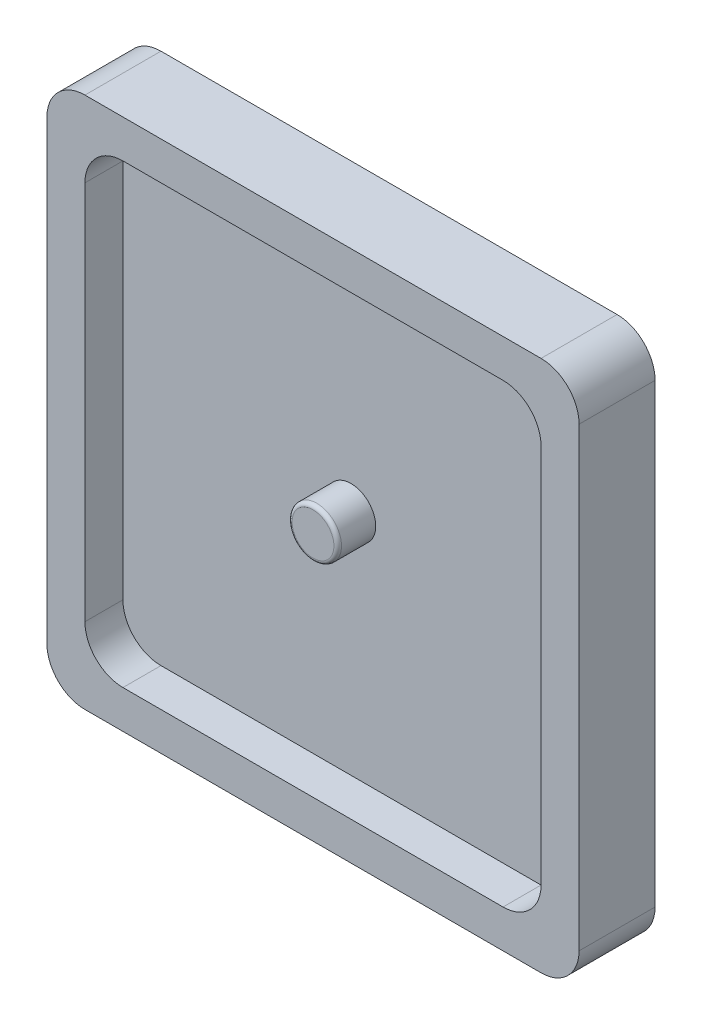
ISO-10303-21;
HEADER;
FILE_DESCRIPTION(('STEP AP214'),'2;1');
FILE_NAME('part.step','',(''),(''),'','','');
FILE_SCHEMA(('AUTOMOTIVE_DESIGN { 1 0 10303 214 1 1 1 1 }'));
ENDSEC;
DATA;
#1=APPLICATION_CONTEXT('core data for automotive mechanical design processes');
#2=APPLICATION_PROTOCOL_DEFINITION('international standard','automotive_design',2000,#1);
#3=PRODUCT_CONTEXT('',#1,'mechanical');
#4=PRODUCT('Part','Part','',(#3));
#5=PRODUCT_RELATED_PRODUCT_CATEGORY('part','',(#4));
#6=PRODUCT_DEFINITION_FORMATION('','',#4);
#7=PRODUCT_DEFINITION_CONTEXT('part definition',#1,'design');
#8=PRODUCT_DEFINITION('design','',#6,#7);
#9=PRODUCT_DEFINITION_SHAPE('','',#8);
#10=(LENGTH_UNIT() NAMED_UNIT(*) SI_UNIT(.MILLI.,.METRE.));
#11=(NAMED_UNIT(*) PLANE_ANGLE_UNIT() SI_UNIT($,.RADIAN.));
#12=(NAMED_UNIT(*) SI_UNIT($,.STERADIAN.) SOLID_ANGLE_UNIT());
#13=UNCERTAINTY_MEASURE_WITH_UNIT(LENGTH_MEASURE(1.E-05),#10,'distance_accuracy_value','');
#14=(GEOMETRIC_REPRESENTATION_CONTEXT(3) GLOBAL_UNCERTAINTY_ASSIGNED_CONTEXT((#13)) GLOBAL_UNIT_ASSIGNED_CONTEXT((#10,
#11,#12)) REPRESENTATION_CONTEXT('',''));
#15=CARTESIAN_POINT('',(0.,0.,0.));
#16=DIRECTION('',(0.,0.,1.));
#17=DIRECTION('',(1.,0.,0.));
#18=AXIS2_PLACEMENT_3D('',#15,#16,#17);
#19=CARTESIAN_POINT('',(70.,-70.,20.));
#20=DIRECTION('',(-1.,0.,0.));
#21=DIRECTION('',(0.,0.,1.));
#22=AXIS2_PLACEMENT_3D('',#19,#20,#21);
#23=PLANE('',#22);
#24=DIRECTION('',(0.,1.,0.));
#25=VECTOR('',#24,1.);
#26=CARTESIAN_POINT('',(70.,-70.,20.));
#27=LINE('',#26,#25);
#28=CARTESIAN_POINT('',(70.,-60.,20.));
#29=VERTEX_POINT('',#28);
#30=CARTESIAN_POINT('',(70.,60.,20.));
#31=VERTEX_POINT('',#30);
#32=EDGE_CURVE('E189',#29,#31,#27,.T.);
#33=ORIENTED_EDGE('',*,*,#32,.F.);
#34=DIRECTION('',(0.,0.,-1.));
#35=VECTOR('',#34,1.);
#36=CARTESIAN_POINT('',(70.,-60.,20.));
#37=LINE('',#36,#35);
#38=CARTESIAN_POINT('',(70.,-60.,0.));
#39=VERTEX_POINT('',#38);
#40=EDGE_CURVE('E238',#29,#39,#37,.T.);
#41=ORIENTED_EDGE('',*,*,#40,.T.);
#42=DIRECTION('',(0.,1.,0.));
#43=VECTOR('',#42,1.);
#44=CARTESIAN_POINT('',(70.,-70.,0.));
#45=LINE('',#44,#43);
#46=CARTESIAN_POINT('',(70.,60.,0.));
#47=VERTEX_POINT('',#46);
#48=EDGE_CURVE('E200',#39,#47,#45,.T.);
#49=ORIENTED_EDGE('',*,*,#48,.T.);
#50=DIRECTION('',(0.,0.,-1.));
#51=VECTOR('',#50,1.);
#52=CARTESIAN_POINT('',(70.,60.,20.));
#53=LINE('',#52,#51);
#54=EDGE_CURVE('E236',#47,#31,#53,.F.);
#55=ORIENTED_EDGE('',*,*,#54,.T.);
#56=EDGE_LOOP('',(#33,#41,#49,#55));
#57=FACE_BOUND('',#56,.T.);
#58=ADVANCED_FACE('F37',(#57),#23,.F.);
#59=CARTESIAN_POINT('',(-70.,70.,20.));
#60=DIRECTION('',(0.,-1.,0.));
#61=DIRECTION('',(0.,0.,-1.));
#62=AXIS2_PLACEMENT_3D('',#59,#60,#61);
#63=PLANE('',#62);
#64=DIRECTION('',(-1.,0.,0.));
#65=VECTOR('',#64,1.);
#66=CARTESIAN_POINT('',(-70.,70.,20.));
#67=LINE('',#66,#65);
#68=CARTESIAN_POINT('',(60.,70.,20.));
#69=VERTEX_POINT('',#68);
#70=CARTESIAN_POINT('',(-60.,70.,20.));
#71=VERTEX_POINT('',#70);
#72=EDGE_CURVE('E192',#69,#71,#67,.T.);
#73=ORIENTED_EDGE('',*,*,#72,.F.);
#74=DIRECTION('',(0.,0.,-1.));
#75=VECTOR('',#74,1.);
#76=CARTESIAN_POINT('',(60.,70.,20.));
#77=LINE('',#76,#75);
#78=CARTESIAN_POINT('',(60.,70.,0.));
#79=VERTEX_POINT('',#78);
#80=EDGE_CURVE('E267',#69,#79,#77,.T.);
#81=ORIENTED_EDGE('',*,*,#80,.T.);
#82=DIRECTION('',(-1.,0.,0.));
#83=VECTOR('',#82,1.);
#84=CARTESIAN_POINT('',(-70.,70.,0.));
#85=LINE('',#84,#83);
#86=CARTESIAN_POINT('',(-60.,70.,0.));
#87=VERTEX_POINT('',#86);
#88=EDGE_CURVE('E203',#79,#87,#85,.T.);
#89=ORIENTED_EDGE('',*,*,#88,.T.);
#90=DIRECTION('',(0.,0.,-1.));
#91=VECTOR('',#90,1.);
#92=CARTESIAN_POINT('',(-60.,70.,20.));
#93=LINE('',#92,#91);
#94=EDGE_CURVE('E265',#87,#71,#93,.F.);
#95=ORIENTED_EDGE('',*,*,#94,.T.);
#96=EDGE_LOOP('',(#73,#81,#89,#95));
#97=FACE_BOUND('',#96,.T.);
#98=ADVANCED_FACE('F286',(#97),#63,.F.);
#99=CARTESIAN_POINT('',(-70.,-70.,20.));
#100=DIRECTION('',(1.,0.,0.));
#101=DIRECTION('',(0.,0.,-1.));
#102=AXIS2_PLACEMENT_3D('',#99,#100,#101);
#103=PLANE('',#102);
#104=DIRECTION('',(0.,-1.,0.));
#105=VECTOR('',#104,1.);
#106=CARTESIAN_POINT('',(-70.,-70.,0.));
#107=LINE('',#106,#105);
#108=CARTESIAN_POINT('',(-70.,60.,0.));
#109=VERTEX_POINT('',#108);
#110=CARTESIAN_POINT('',(-70.,-60.,0.));
#111=VERTEX_POINT('',#110);
#112=EDGE_CURVE('E206',#109,#111,#107,.T.);
#113=ORIENTED_EDGE('',*,*,#112,.T.);
#114=DIRECTION('',(0.,0.,-1.));
#115=VECTOR('',#114,1.);
#116=CARTESIAN_POINT('',(-70.,-60.,20.));
#117=LINE('',#116,#115);
#118=CARTESIAN_POINT('',(-70.,-60.,20.));
#119=VERTEX_POINT('',#118);
#120=EDGE_CURVE('E52',#111,#119,#117,.F.);
#121=ORIENTED_EDGE('',*,*,#120,.T.);
#122=DIRECTION('',(0.,-1.,0.));
#123=VECTOR('',#122,1.);
#124=CARTESIAN_POINT('',(-70.,-70.,20.));
#125=LINE('',#124,#123);
#126=CARTESIAN_POINT('',(-70.,60.,20.));
#127=VERTEX_POINT('',#126);
#128=EDGE_CURVE('E195',#127,#119,#125,.T.);
#129=ORIENTED_EDGE('',*,*,#128,.F.);
#130=DIRECTION('',(0.,0.,-1.));
#131=VECTOR('',#130,1.);
#132=CARTESIAN_POINT('',(-70.,60.,20.));
#133=LINE('',#132,#131);
#134=EDGE_CURVE('E261',#127,#109,#133,.T.);
#135=ORIENTED_EDGE('',*,*,#134,.T.);
#136=EDGE_LOOP('',(#113,#121,#129,#135));
#137=FACE_BOUND('',#136,.T.);
#138=ADVANCED_FACE('F292',(#137),#103,.F.);
#139=CARTESIAN_POINT('',(-70.,-70.,20.));
#140=DIRECTION('',(0.,1.,0.));
#141=DIRECTION('',(0.,0.,1.));
#142=AXIS2_PLACEMENT_3D('',#139,#140,#141);
#143=PLANE('',#142);
#144=DIRECTION('',(1.,0.,0.));
#145=VECTOR('',#144,1.);
#146=CARTESIAN_POINT('',(-70.,-70.,0.));
#147=LINE('',#146,#145);
#148=CARTESIAN_POINT('',(-60.,-70.,0.));
#149=VERTEX_POINT('',#148);
#150=CARTESIAN_POINT('',(60.,-70.,0.));
#151=VERTEX_POINT('',#150);
#152=EDGE_CURVE('E193',#149,#151,#147,.T.);
#153=ORIENTED_EDGE('',*,*,#152,.T.);
#154=DIRECTION('',(0.,0.,-1.));
#155=VECTOR('',#154,1.);
#156=CARTESIAN_POINT('',(60.,-70.,20.));
#157=LINE('',#156,#155);
#158=CARTESIAN_POINT('',(60.,-70.,20.));
#159=VERTEX_POINT('',#158);
#160=EDGE_CURVE('E252',#151,#159,#157,.F.);
#161=ORIENTED_EDGE('',*,*,#160,.T.);
#162=DIRECTION('',(1.,0.,0.));
#163=VECTOR('',#162,1.);
#164=CARTESIAN_POINT('',(-70.,-70.,20.));
#165=LINE('',#164,#163);
#166=CARTESIAN_POINT('',(-60.,-70.,20.));
#167=VERTEX_POINT('',#166);
#168=EDGE_CURVE('E197',#167,#159,#165,.T.);
#169=ORIENTED_EDGE('',*,*,#168,.F.);
#170=DIRECTION('',(0.,0.,-1.));
#171=VECTOR('',#170,1.);
#172=CARTESIAN_POINT('',(-60.,-70.,20.));
#173=LINE('',#172,#171);
#174=EDGE_CURVE('E249',#167,#149,#173,.T.);
#175=ORIENTED_EDGE('',*,*,#174,.T.);
#176=EDGE_LOOP('',(#153,#161,#169,#175));
#177=FACE_BOUND('',#176,.T.);
#178=ADVANCED_FACE('F344',(#177),#143,.F.);
#179=CARTESIAN_POINT('',(0.,0.,20.));
#180=DIRECTION('',(0.,0.,-1.));
#181=DIRECTION('',(-1.,0.,0.));
#182=AXIS2_PLACEMENT_3D('',#179,#180,#181);
#183=PLANE('',#182);
#184=DIRECTION('',(-1.,0.,0.));
#185=VECTOR('',#184,1.);
#186=CARTESIAN_POINT('',(-60.,60.,20.));
#187=LINE('',#186,#185);
#188=CARTESIAN_POINT('',(50.,60.,20.));
#189=VERTEX_POINT('',#188);
#190=CARTESIAN_POINT('',(-50.,60.,20.));
#191=VERTEX_POINT('',#190);
#192=EDGE_CURVE('E185',#189,#191,#187,.T.);
#193=ORIENTED_EDGE('',*,*,#192,.F.);
#194=CARTESIAN_POINT('',(50.,50.,20.));
#195=DIRECTION('',(0.,0.,-1.));
#196=DIRECTION('',(-1.,0.,0.));
#197=AXIS2_PLACEMENT_3D('',#194,#195,#196);
#198=CIRCLE('',#197,10.);
#199=CARTESIAN_POINT('',(60.,50.,20.));
#200=VERTEX_POINT('',#199);
#201=EDGE_CURVE('E232',#189,#200,#198,.T.);
#202=ORIENTED_EDGE('',*,*,#201,.T.);
#203=DIRECTION('',(0.,1.,0.));
#204=VECTOR('',#203,1.);
#205=CARTESIAN_POINT('',(60.,-60.,20.));
#206=LINE('',#205,#204);
#207=CARTESIAN_POINT('',(60.,-50.,20.));
#208=VERTEX_POINT('',#207);
#209=EDGE_CURVE('E559',#208,#200,#206,.T.);
#210=ORIENTED_EDGE('',*,*,#209,.F.);
#211=CARTESIAN_POINT('',(50.,-50.,20.));
#212=DIRECTION('',(0.,0.,-1.));
#213=DIRECTION('',(-1.,0.,0.));
#214=AXIS2_PLACEMENT_3D('',#211,#212,#213);
#215=CIRCLE('',#214,10.);
#216=CARTESIAN_POINT('',(50.,-60.,20.));
#217=VERTEX_POINT('',#216);
#218=EDGE_CURVE('E162',#208,#217,#215,.T.);
#219=ORIENTED_EDGE('',*,*,#218,.T.);
#220=DIRECTION('',(1.,0.,0.));
#221=VECTOR('',#220,1.);
#222=CARTESIAN_POINT('',(-60.,-60.,20.));
#223=LINE('',#222,#221);
#224=CARTESIAN_POINT('',(-50.,-60.,20.));
#225=VERTEX_POINT('',#224);
#226=EDGE_CURVE('E169',#225,#217,#223,.T.);
#227=ORIENTED_EDGE('',*,*,#226,.F.);
#228=CARTESIAN_POINT('',(-50.,-50.,20.));
#229=DIRECTION('',(0.,0.,-1.));
#230=DIRECTION('',(-1.,0.,0.));
#231=AXIS2_PLACEMENT_3D('',#228,#229,#230);
#232=CIRCLE('',#231,10.);
#233=CARTESIAN_POINT('',(-60.,-50.,20.));
#234=VERTEX_POINT('',#233);
#235=EDGE_CURVE('E152',#225,#234,#232,.T.);
#236=ORIENTED_EDGE('',*,*,#235,.T.);
#237=DIRECTION('',(0.,-1.,0.));
#238=VECTOR('',#237,1.);
#239=CARTESIAN_POINT('',(-60.,-60.,20.));
#240=LINE('',#239,#238);
#241=CARTESIAN_POINT('',(-60.,50.,20.));
#242=VERTEX_POINT('',#241);
#243=EDGE_CURVE('E180',#242,#234,#240,.T.);
#244=ORIENTED_EDGE('',*,*,#243,.F.);
#245=CARTESIAN_POINT('',(-50.,50.,20.));
#246=DIRECTION('',(0.,0.,-1.));
#247=DIRECTION('',(-1.,0.,0.));
#248=AXIS2_PLACEMENT_3D('',#245,#246,#247);
#249=CIRCLE('',#248,10.);
#250=EDGE_CURVE('E234',#242,#191,#249,.T.);
#251=ORIENTED_EDGE('',*,*,#250,.T.);
#252=EDGE_LOOP('',(#193,#202,#210,#219,#227,#236,#244,#251));
#253=FACE_BOUND('',#252,.T.);
#254=ORIENTED_EDGE('',*,*,#168,.T.);
#255=CARTESIAN_POINT('',(60.,-60.,20.));
#256=DIRECTION('',(0.,0.,-1.));
#257=DIRECTION('',(-1.,0.,0.));
#258=AXIS2_PLACEMENT_3D('',#255,#256,#257);
#259=CIRCLE('',#258,10.);
#260=EDGE_CURVE('E259',#159,#29,#259,.F.);
#261=ORIENTED_EDGE('',*,*,#260,.T.);
#262=ORIENTED_EDGE('',*,*,#32,.T.);
#263=CARTESIAN_POINT('',(60.,60.,20.));
#264=DIRECTION('',(0.,0.,-1.));
#265=DIRECTION('',(-1.,0.,0.));
#266=AXIS2_PLACEMENT_3D('',#263,#264,#265);
#267=CIRCLE('',#266,10.);
#268=EDGE_CURVE('E255',#31,#69,#267,.F.);
#269=ORIENTED_EDGE('',*,*,#268,.T.);
#270=ORIENTED_EDGE('',*,*,#72,.T.);
#271=CARTESIAN_POINT('',(-60.,60.,20.));
#272=DIRECTION('',(0.,0.,-1.));
#273=DIRECTION('',(-1.,0.,0.));
#274=AXIS2_PLACEMENT_3D('',#271,#272,#273);
#275=CIRCLE('',#274,10.);
#276=EDGE_CURVE('E59',#71,#127,#275,.F.);
#277=ORIENTED_EDGE('',*,*,#276,.T.);
#278=ORIENTED_EDGE('',*,*,#128,.T.);
#279=CARTESIAN_POINT('',(-60.,-60.,20.));
#280=DIRECTION('',(0.,0.,-1.));
#281=DIRECTION('',(-1.,0.,0.));
#282=AXIS2_PLACEMENT_3D('',#279,#280,#281);
#283=CIRCLE('',#282,10.);
#284=EDGE_CURVE('E257',#119,#167,#283,.F.);
#285=ORIENTED_EDGE('',*,*,#284,.T.);
#286=EDGE_LOOP('',(#254,#261,#262,#269,#270,#277,#278,#285));
#287=FACE_BOUND('',#286,.T.);
#288=ADVANCED_FACE('F177',(#253,#287),#183,.F.);
#289=CARTESIAN_POINT('',(0.,0.,0.));
#290=DIRECTION('',(0.,0.,-1.));
#291=DIRECTION('',(-1.,0.,0.));
#292=AXIS2_PLACEMENT_3D('',#289,#290,#291);
#293=PLANE('',#292);
#294=ORIENTED_EDGE('',*,*,#48,.F.);
#295=CARTESIAN_POINT('',(60.,-60.,0.));
#296=DIRECTION('',(0.,0.,-1.));
#297=DIRECTION('',(-1.,0.,0.));
#298=AXIS2_PLACEMENT_3D('',#295,#296,#297);
#299=CIRCLE('',#298,10.);
#300=EDGE_CURVE('E247',#39,#151,#299,.T.);
#301=ORIENTED_EDGE('',*,*,#300,.T.);
#302=ORIENTED_EDGE('',*,*,#152,.F.);
#303=CARTESIAN_POINT('',(-60.,-60.,0.));
#304=DIRECTION('',(0.,0.,-1.));
#305=DIRECTION('',(-1.,0.,0.));
#306=AXIS2_PLACEMENT_3D('',#303,#304,#305);
#307=CIRCLE('',#306,10.);
#308=EDGE_CURVE('E245',#149,#111,#307,.T.);
#309=ORIENTED_EDGE('',*,*,#308,.T.);
#310=ORIENTED_EDGE('',*,*,#112,.F.);
#311=CARTESIAN_POINT('',(-60.,60.,0.));
#312=DIRECTION('',(0.,0.,-1.));
#313=DIRECTION('',(-1.,0.,0.));
#314=AXIS2_PLACEMENT_3D('',#311,#312,#313);
#315=CIRCLE('',#314,10.);
#316=EDGE_CURVE('E241',#109,#87,#315,.T.);
#317=ORIENTED_EDGE('',*,*,#316,.T.);
#318=ORIENTED_EDGE('',*,*,#88,.F.);
#319=CARTESIAN_POINT('',(60.,60.,0.));
#320=DIRECTION('',(0.,0.,-1.));
#321=DIRECTION('',(-1.,0.,0.));
#322=AXIS2_PLACEMENT_3D('',#319,#320,#321);
#323=CIRCLE('',#322,10.);
#324=EDGE_CURVE('E243',#79,#47,#323,.T.);
#325=ORIENTED_EDGE('',*,*,#324,.T.);
#326=EDGE_LOOP('',(#294,#301,#302,#309,#310,#317,#318,#325));
#327=FACE_BOUND('',#326,.T.);
#328=ADVANCED_FACE('F337',(#327),#293,.T.);
#329=CARTESIAN_POINT('',(60.,-60.,10.));
#330=DIRECTION('',(1.,0.,0.));
#331=DIRECTION('',(0.,0.,-1.));
#332=AXIS2_PLACEMENT_3D('',#329,#330,#331);
#333=PLANE('',#332);
#334=DIRECTION('',(0.,1.,0.));
#335=VECTOR('',#334,1.);
#336=CARTESIAN_POINT('',(60.,-60.,10.));
#337=LINE('',#336,#335);
#338=CARTESIAN_POINT('',(60.,-50.,10.));
#339=VERTEX_POINT('',#338);
#340=CARTESIAN_POINT('',(60.,50.,10.));
#341=VERTEX_POINT('',#340);
#342=EDGE_CURVE('E179',#339,#341,#337,.T.);
#343=ORIENTED_EDGE('',*,*,#342,.F.);
#344=DIRECTION('',(0.,0.,1.));
#345=VECTOR('',#344,1.);
#346=CARTESIAN_POINT('',(60.,-50.,20.));
#347=LINE('',#346,#345);
#348=EDGE_CURVE('E224',#339,#208,#347,.T.);
#349=ORIENTED_EDGE('',*,*,#348,.T.);
#350=ORIENTED_EDGE('',*,*,#209,.T.);
#351=DIRECTION('',(0.,0.,1.));
#352=VECTOR('',#351,1.);
#353=CARTESIAN_POINT('',(60.,50.,10.));
#354=LINE('',#353,#352);
#355=EDGE_CURVE('E222',#200,#341,#354,.F.);
#356=ORIENTED_EDGE('',*,*,#355,.T.);
#357=EDGE_LOOP('',(#343,#349,#350,#356));
#358=FACE_BOUND('',#357,.T.);
#359=ADVANCED_FACE('F358',(#358),#333,.F.);
#360=CARTESIAN_POINT('',(-60.,-60.,10.));
#361=DIRECTION('',(0.,-1.,0.));
#362=DIRECTION('',(0.,0.,-1.));
#363=AXIS2_PLACEMENT_3D('',#360,#361,#362);
#364=PLANE('',#363);
#365=DIRECTION('',(1.,0.,0.));
#366=VECTOR('',#365,1.);
#367=CARTESIAN_POINT('',(-60.,-60.,10.));
#368=LINE('',#367,#366);
#369=CARTESIAN_POINT('',(-50.,-60.,10.));
#370=VERTEX_POINT('',#369);
#371=CARTESIAN_POINT('',(50.,-60.,10.));
#372=VERTEX_POINT('',#371);
#373=EDGE_CURVE('E172',#370,#372,#368,.T.);
#374=ORIENTED_EDGE('',*,*,#373,.F.);
#375=DIRECTION('',(0.,0.,1.));
#376=VECTOR('',#375,1.);
#377=CARTESIAN_POINT('',(-50.,-60.,20.));
#378=LINE('',#377,#376);
#379=EDGE_CURVE('E156',#370,#225,#378,.T.);
#380=ORIENTED_EDGE('',*,*,#379,.T.);
#381=ORIENTED_EDGE('',*,*,#226,.T.);
#382=DIRECTION('',(0.,0.,1.));
#383=VECTOR('',#382,1.);
#384=CARTESIAN_POINT('',(50.,-60.,10.));
#385=LINE('',#384,#383);
#386=EDGE_CURVE('E174',#217,#372,#385,.F.);
#387=ORIENTED_EDGE('',*,*,#386,.T.);
#388=EDGE_LOOP('',(#374,#380,#381,#387));
#389=FACE_BOUND('',#388,.T.);
#390=ADVANCED_FACE('F168',(#389),#364,.F.);
#391=CARTESIAN_POINT('',(-60.,-60.,10.));
#392=DIRECTION('',(-1.,0.,0.));
#393=DIRECTION('',(0.,0.,1.));
#394=AXIS2_PLACEMENT_3D('',#391,#392,#393);
#395=PLANE('',#394);
#396=ORIENTED_EDGE('',*,*,#243,.T.);
#397=DIRECTION('',(0.,0.,1.));
#398=VECTOR('',#397,1.);
#399=CARTESIAN_POINT('',(-60.,-50.,10.));
#400=LINE('',#399,#398);
#401=CARTESIAN_POINT('',(-60.,-50.,10.));
#402=VERTEX_POINT('',#401);
#403=EDGE_CURVE('E157',#234,#402,#400,.F.);
#404=ORIENTED_EDGE('',*,*,#403,.T.);
#405=DIRECTION('',(0.,-1.,0.));
#406=VECTOR('',#405,1.);
#407=CARTESIAN_POINT('',(-60.,-60.,10.));
#408=LINE('',#407,#406);
#409=CARTESIAN_POINT('',(-60.,50.,10.));
#410=VERTEX_POINT('',#409);
#411=EDGE_CURVE('E554',#410,#402,#408,.T.);
#412=ORIENTED_EDGE('',*,*,#411,.F.);
#413=DIRECTION('',(0.,0.,1.));
#414=VECTOR('',#413,1.);
#415=CARTESIAN_POINT('',(-60.,50.,20.));
#416=LINE('',#415,#414);
#417=EDGE_CURVE('E173',#410,#242,#416,.T.);
#418=ORIENTED_EDGE('',*,*,#417,.T.);
#419=EDGE_LOOP('',(#396,#404,#412,#418));
#420=FACE_BOUND('',#419,.T.);
#421=ADVANCED_FACE('F484',(#420),#395,.F.);
#422=CARTESIAN_POINT('',(-60.,60.,10.));
#423=DIRECTION('',(0.,1.,0.));
#424=DIRECTION('',(0.,0.,1.));
#425=AXIS2_PLACEMENT_3D('',#422,#423,#424);
#426=PLANE('',#425);
#427=DIRECTION('',(-1.,0.,0.));
#428=VECTOR('',#427,1.);
#429=CARTESIAN_POINT('',(-60.,60.,10.));
#430=LINE('',#429,#428);
#431=CARTESIAN_POINT('',(50.,60.,10.));
#432=VERTEX_POINT('',#431);
#433=CARTESIAN_POINT('',(-50.,60.,10.));
#434=VERTEX_POINT('',#433);
#435=EDGE_CURVE('E183',#432,#434,#430,.T.);
#436=ORIENTED_EDGE('',*,*,#435,.F.);
#437=DIRECTION('',(0.,0.,1.));
#438=VECTOR('',#437,1.);
#439=CARTESIAN_POINT('',(50.,60.,20.));
#440=LINE('',#439,#438);
#441=EDGE_CURVE('E163',#432,#189,#440,.T.);
#442=ORIENTED_EDGE('',*,*,#441,.T.);
#443=ORIENTED_EDGE('',*,*,#192,.T.);
#444=DIRECTION('',(0.,0.,1.));
#445=VECTOR('',#444,1.);
#446=CARTESIAN_POINT('',(-50.,60.,10.));
#447=LINE('',#446,#445);
#448=EDGE_CURVE('E227',#191,#434,#447,.F.);
#449=ORIENTED_EDGE('',*,*,#448,.T.);
#450=EDGE_LOOP('',(#436,#442,#443,#449));
#451=FACE_BOUND('',#450,.T.);
#452=ADVANCED_FACE('F424',(#451),#426,.F.);
#453=CARTESIAN_POINT('',(0.,0.,10.));
#454=DIRECTION('',(0.,0.,-1.));
#455=DIRECTION('',(-1.,0.,0.));
#456=AXIS2_PLACEMENT_3D('',#453,#454,#455);
#457=PLANE('',#456);
#458=CARTESIAN_POINT('',(0.,0.,10.));
#459=DIRECTION('',(0.,0.,-1.));
#460=DIRECTION('',(-1.,0.,0.));
#461=AXIS2_PLACEMENT_3D('',#458,#459,#460);
#462=CIRCLE('',#461,6.5);
#463=CARTESIAN_POINT('',(-6.5,0.,10.));
#464=VERTEX_POINT('',#463);
#465=EDGE_CURVE('E270',#464,#464,#462,.F.);
#466=ORIENTED_EDGE('',*,*,#465,.F.);
#467=EDGE_LOOP('',(#466));
#468=FACE_BOUND('',#467,.T.);
#469=ORIENTED_EDGE('',*,*,#411,.T.);
#470=CARTESIAN_POINT('',(-50.,-50.,10.));
#471=DIRECTION('',(0.,0.,-1.));
#472=DIRECTION('',(-1.,0.,0.));
#473=AXIS2_PLACEMENT_3D('',#470,#471,#472);
#474=CIRCLE('',#473,10.);
#475=EDGE_CURVE('E220',#402,#370,#474,.F.);
#476=ORIENTED_EDGE('',*,*,#475,.T.);
#477=ORIENTED_EDGE('',*,*,#373,.T.);
#478=CARTESIAN_POINT('',(50.,-50.,10.));
#479=DIRECTION('',(0.,0.,-1.));
#480=DIRECTION('',(-1.,0.,0.));
#481=AXIS2_PLACEMENT_3D('',#478,#479,#480);
#482=CIRCLE('',#481,10.);
#483=EDGE_CURVE('E218',#372,#339,#482,.F.);
#484=ORIENTED_EDGE('',*,*,#483,.T.);
#485=ORIENTED_EDGE('',*,*,#342,.T.);
#486=CARTESIAN_POINT('',(50.,50.,10.));
#487=DIRECTION('',(0.,0.,-1.));
#488=DIRECTION('',(-1.,0.,0.));
#489=AXIS2_PLACEMENT_3D('',#486,#487,#488);
#490=CIRCLE('',#489,10.);
#491=EDGE_CURVE('E216',#341,#432,#490,.F.);
#492=ORIENTED_EDGE('',*,*,#491,.T.);
#493=ORIENTED_EDGE('',*,*,#435,.T.);
#494=CARTESIAN_POINT('',(-50.,50.,10.));
#495=DIRECTION('',(0.,0.,-1.));
#496=DIRECTION('',(-1.,0.,0.));
#497=AXIS2_PLACEMENT_3D('',#494,#495,#496);
#498=CIRCLE('',#497,10.);
#499=EDGE_CURVE('E214',#434,#410,#498,.F.);
#500=ORIENTED_EDGE('',*,*,#499,.T.);
#501=EDGE_LOOP('',(#469,#476,#477,#484,#485,#492,#493,#500));
#502=FACE_BOUND('',#501,.T.);
#503=ADVANCED_FACE('F301',(#468,#502),#457,.F.);
#504=CARTESIAN_POINT('',(-50.,-50.,10.));
#505=DIRECTION('',(0.,0.,-1.));
#506=DIRECTION('',(-1.,0.,0.));
#507=AXIS2_PLACEMENT_3D('',#504,#505,#506);
#508=CYLINDRICAL_SURFACE('',#507,10.);
#509=ORIENTED_EDGE('',*,*,#475,.F.);
#510=ORIENTED_EDGE('',*,*,#403,.F.);
#511=ORIENTED_EDGE('',*,*,#235,.F.);
#512=ORIENTED_EDGE('',*,*,#379,.F.);
#513=EDGE_LOOP('',(#509,#510,#511,#512));
#514=FACE_BOUND('',#513,.T.);
#515=ADVANCED_FACE('F155',(#514),#508,.F.);
#516=CARTESIAN_POINT('',(50.,-50.,10.));
#517=DIRECTION('',(0.,0.,-1.));
#518=DIRECTION('',(-1.,0.,0.));
#519=AXIS2_PLACEMENT_3D('',#516,#517,#518);
#520=CYLINDRICAL_SURFACE('',#519,10.);
#521=ORIENTED_EDGE('',*,*,#483,.F.);
#522=ORIENTED_EDGE('',*,*,#386,.F.);
#523=ORIENTED_EDGE('',*,*,#218,.F.);
#524=ORIENTED_EDGE('',*,*,#348,.F.);
#525=EDGE_LOOP('',(#521,#522,#523,#524));
#526=FACE_BOUND('',#525,.T.);
#527=ADVANCED_FACE('F300',(#526),#520,.F.);
#528=CARTESIAN_POINT('',(50.,50.,10.));
#529=DIRECTION('',(0.,0.,-1.));
#530=DIRECTION('',(-1.,0.,0.));
#531=AXIS2_PLACEMENT_3D('',#528,#529,#530);
#532=CYLINDRICAL_SURFACE('',#531,10.);
#533=ORIENTED_EDGE('',*,*,#491,.F.);
#534=ORIENTED_EDGE('',*,*,#355,.F.);
#535=ORIENTED_EDGE('',*,*,#201,.F.);
#536=ORIENTED_EDGE('',*,*,#441,.F.);
#537=EDGE_LOOP('',(#533,#534,#535,#536));
#538=FACE_BOUND('',#537,.T.);
#539=ADVANCED_FACE('F304',(#538),#532,.F.);
#540=CARTESIAN_POINT('',(-50.,50.,10.));
#541=DIRECTION('',(0.,0.,-1.));
#542=DIRECTION('',(-1.,0.,0.));
#543=AXIS2_PLACEMENT_3D('',#540,#541,#542);
#544=CYLINDRICAL_SURFACE('',#543,10.);
#545=ORIENTED_EDGE('',*,*,#499,.F.);
#546=ORIENTED_EDGE('',*,*,#448,.F.);
#547=ORIENTED_EDGE('',*,*,#250,.F.);
#548=ORIENTED_EDGE('',*,*,#417,.F.);
#549=EDGE_LOOP('',(#545,#546,#547,#548));
#550=FACE_BOUND('',#549,.T.);
#551=ADVANCED_FACE('F308',(#550),#544,.F.);
#552=CARTESIAN_POINT('',(60.,-60.,20.));
#553=DIRECTION('',(0.,0.,-1.));
#554=DIRECTION('',(-1.,0.,0.));
#555=AXIS2_PLACEMENT_3D('',#552,#553,#554);
#556=CYLINDRICAL_SURFACE('',#555,10.);
#557=ORIENTED_EDGE('',*,*,#260,.F.);
#558=ORIENTED_EDGE('',*,*,#160,.F.);
#559=ORIENTED_EDGE('',*,*,#300,.F.);
#560=ORIENTED_EDGE('',*,*,#40,.F.);
#561=EDGE_LOOP('',(#557,#558,#559,#560));
#562=FACE_BOUND('',#561,.T.);
#563=ADVANCED_FACE('F312',(#562),#556,.T.);
#564=CARTESIAN_POINT('',(-60.,-60.,20.));
#565=DIRECTION('',(0.,0.,-1.));
#566=DIRECTION('',(-1.,0.,0.));
#567=AXIS2_PLACEMENT_3D('',#564,#565,#566);
#568=CYLINDRICAL_SURFACE('',#567,10.);
#569=ORIENTED_EDGE('',*,*,#284,.F.);
#570=ORIENTED_EDGE('',*,*,#120,.F.);
#571=ORIENTED_EDGE('',*,*,#308,.F.);
#572=ORIENTED_EDGE('',*,*,#174,.F.);
#573=EDGE_LOOP('',(#569,#570,#571,#572));
#574=FACE_BOUND('',#573,.T.);
#575=ADVANCED_FACE('F316',(#574),#568,.T.);
#576=CARTESIAN_POINT('',(60.,60.,20.));
#577=DIRECTION('',(0.,0.,-1.));
#578=DIRECTION('',(-1.,0.,0.));
#579=AXIS2_PLACEMENT_3D('',#576,#577,#578);
#580=CYLINDRICAL_SURFACE('',#579,10.);
#581=ORIENTED_EDGE('',*,*,#268,.F.);
#582=ORIENTED_EDGE('',*,*,#54,.F.);
#583=ORIENTED_EDGE('',*,*,#324,.F.);
#584=ORIENTED_EDGE('',*,*,#80,.F.);
#585=EDGE_LOOP('',(#581,#582,#583,#584));
#586=FACE_BOUND('',#585,.T.);
#587=ADVANCED_FACE('F320',(#586),#580,.T.);
#588=CARTESIAN_POINT('',(-60.,60.,20.));
#589=DIRECTION('',(0.,0.,-1.));
#590=DIRECTION('',(-1.,0.,0.));
#591=AXIS2_PLACEMENT_3D('',#588,#589,#590);
#592=CYLINDRICAL_SURFACE('',#591,10.);
#593=ORIENTED_EDGE('',*,*,#276,.F.);
#594=ORIENTED_EDGE('',*,*,#94,.F.);
#595=ORIENTED_EDGE('',*,*,#316,.F.);
#596=ORIENTED_EDGE('',*,*,#134,.F.);
#597=EDGE_LOOP('',(#593,#594,#595,#596));
#598=FACE_BOUND('',#597,.T.);
#599=ADVANCED_FACE('F323',(#598),#592,.T.);
#600=CARTESIAN_POINT('',(0.,0.,20.));
#601=DIRECTION('',(0.,0.,-1.));
#602=DIRECTION('',(-1.,0.,0.));
#603=AXIS2_PLACEMENT_3D('',#600,#601,#602);
#604=CYLINDRICAL_SURFACE('',#603,6.5);
#605=CARTESIAN_POINT('',(0.,0.,19.));
#606=DIRECTION('',(0.,0.,1.));
#607=DIRECTION('',(1.,0.,0.));
#608=AXIS2_PLACEMENT_3D('',#605,#606,#607);
#609=CIRCLE('',#608,6.5);
#610=CARTESIAN_POINT('',(6.5,0.,19.));
#611=VERTEX_POINT('',#610);
#612=EDGE_CURVE('E11',#611,#611,#609,.F.);
#613=ORIENTED_EDGE('',*,*,#612,.T.);
#614=EDGE_LOOP('',(#613));
#615=FACE_BOUND('',#614,.T.);
#616=ORIENTED_EDGE('',*,*,#465,.T.);
#617=EDGE_LOOP('',(#616));
#618=FACE_BOUND('',#617,.T.);
#619=ADVANCED_FACE('F282',(#615,#618),#604,.T.);
#620=CARTESIAN_POINT('',(0.,0.,20.));
#621=DIRECTION('',(0.,0.,1.));
#622=DIRECTION('',(1.,0.,0.));
#623=AXIS2_PLACEMENT_3D('',#620,#621,#622);
#624=PLANE('',#623);
#625=CARTESIAN_POINT('',(0.,0.,20.));
#626=DIRECTION('',(0.,0.,1.));
#627=DIRECTION('',(1.,0.,0.));
#628=AXIS2_PLACEMENT_3D('',#625,#626,#627);
#629=CIRCLE('',#628,5.5);
#630=CARTESIAN_POINT('',(5.5,0.,20.));
#631=VERTEX_POINT('',#630);
#632=EDGE_CURVE('E45',#631,#631,#629,.T.);
#633=ORIENTED_EDGE('',*,*,#632,.T.);
#634=EDGE_LOOP('',(#633));
#635=FACE_BOUND('',#634,.T.);
#636=ADVANCED_FACE('F275',(#635),#624,.T.);
#637=CARTESIAN_POINT('',(0.,0.,19.));
#638=DIRECTION('',(0.,0.,1.));
#639=DIRECTION('',(1.,0.,0.));
#640=AXIS2_PLACEMENT_3D('',#637,#638,#639);
#641=TOROIDAL_SURFACE('',#640,5.5,1.);
#642=ORIENTED_EDGE('',*,*,#612,.F.);
#643=EDGE_LOOP('',(#642));
#644=FACE_BOUND('',#643,.T.);
#645=ORIENTED_EDGE('',*,*,#632,.F.);
#646=EDGE_LOOP('',(#645));
#647=FACE_BOUND('',#646,.T.);
#648=ADVANCED_FACE('F39',(#644,#647),#641,.T.);
#649=CLOSED_SHELL('',(#58,#98,#138,#178,#288,#328,#359,#390,#421,#452,#503,#515,#527,#539,#551,
#563,#575,#587,#599,#619,#636,#648));
#650=MANIFOLD_SOLID_BREP('B2',#649);
#651=ADVANCED_BREP_SHAPE_REPRESENTATION('',(#18,#650),#14);
#652=SHAPE_DEFINITION_REPRESENTATION(#9,#651);
ENDSEC;
END-ISO-10303-21;
